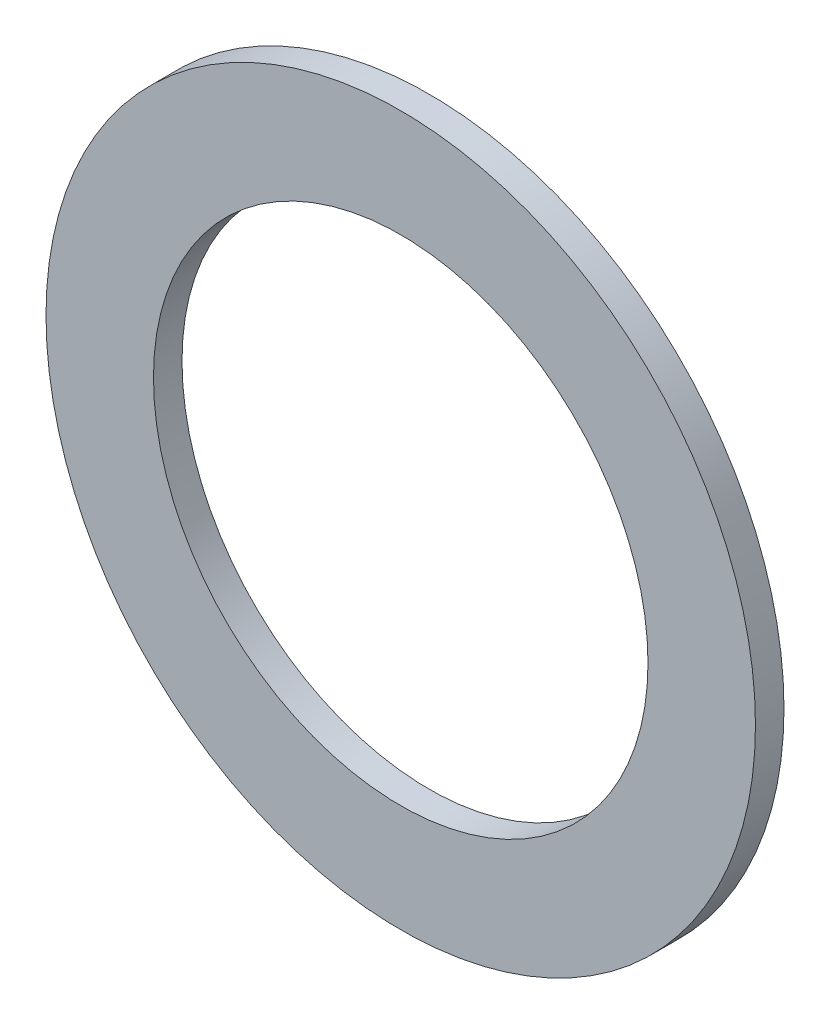
ISO-10303-21;
HEADER;
FILE_DESCRIPTION(('STEP AP214'),'2;1');
FILE_NAME('part.step','',(''),(''),'','','');
FILE_SCHEMA(('AUTOMOTIVE_DESIGN { 1 0 10303 214 1 1 1 1 }'));
ENDSEC;
DATA;
#1=APPLICATION_CONTEXT('core data for automotive mechanical design processes');
#2=APPLICATION_PROTOCOL_DEFINITION('international standard','automotive_design',2000,#1);
#3=PRODUCT_CONTEXT('',#1,'mechanical');
#4=PRODUCT('Part','Part','',(#3));
#5=PRODUCT_RELATED_PRODUCT_CATEGORY('part','',(#4));
#6=PRODUCT_DEFINITION_FORMATION('','',#4);
#7=PRODUCT_DEFINITION_CONTEXT('part definition',#1,'design');
#8=PRODUCT_DEFINITION('design','',#6,#7);
#9=PRODUCT_DEFINITION_SHAPE('','',#8);
#10=(LENGTH_UNIT() NAMED_UNIT(*) SI_UNIT(.MILLI.,.METRE.));
#11=(NAMED_UNIT(*) PLANE_ANGLE_UNIT() SI_UNIT($,.RADIAN.));
#12=(NAMED_UNIT(*) SI_UNIT($,.STERADIAN.) SOLID_ANGLE_UNIT());
#13=UNCERTAINTY_MEASURE_WITH_UNIT(LENGTH_MEASURE(1.E-05),#10,'distance_accuracy_value','');
#14=(GEOMETRIC_REPRESENTATION_CONTEXT(3) GLOBAL_UNCERTAINTY_ASSIGNED_CONTEXT((#13)) GLOBAL_UNIT_ASSIGNED_CONTEXT((#10,
#11,#12)) REPRESENTATION_CONTEXT('',''));
#15=CARTESIAN_POINT('',(0.,0.,0.));
#16=DIRECTION('',(0.,0.,1.));
#17=DIRECTION('',(1.,0.,0.));
#18=AXIS2_PLACEMENT_3D('',#15,#16,#17);
#19=CARTESIAN_POINT('',(0.,37.3,-2.8));
#20=DIRECTION('',(0.,0.,1.));
#21=DIRECTION('',(1.,0.,0.));
#22=AXIS2_PLACEMENT_3D('',#19,#20,#21);
#23=PLANE('',#22);
#24=CARTESIAN_POINT('',(0.,0.,-2.8));
#25=DIRECTION('',(0.,0.,-1.));
#26=DIRECTION('',(-1.,0.,0.));
#27=AXIS2_PLACEMENT_3D('',#24,#25,#26);
#28=CIRCLE('',#27,26.);
#29=CARTESIAN_POINT('',(-26.,0.,-2.8));
#30=VERTEX_POINT('',#29);
#31=EDGE_CURVE('E12',#30,#30,#28,.T.);
#32=ORIENTED_EDGE('',*,*,#31,.T.);
#33=EDGE_LOOP('',(#32));
#34=FACE_BOUND('',#33,.T.);
#35=CARTESIAN_POINT('',(0.,0.,-2.8));
#36=DIRECTION('',(0.,0.,-1.));
#37=DIRECTION('',(-1.,0.,0.));
#38=AXIS2_PLACEMENT_3D('',#35,#36,#37);
#39=CIRCLE('',#38,37.3);
#40=CARTESIAN_POINT('',(-37.3,0.,-2.8));
#41=VERTEX_POINT('',#40);
#42=EDGE_CURVE('E73',#41,#41,#39,.T.);
#43=ORIENTED_EDGE('',*,*,#42,.F.);
#44=EDGE_LOOP('',(#43));
#45=FACE_BOUND('',#44,.T.);
#46=ADVANCED_FACE('F59',(#34,#45),#23,.T.);
#47=CARTESIAN_POINT('',(0.,0.,-5.48));
#48=DIRECTION('',(0.,0.,-1.));
#49=DIRECTION('',(-1.,0.,0.));
#50=AXIS2_PLACEMENT_3D('',#47,#48,#49);
#51=CYLINDRICAL_SURFACE('',#50,26.);
#52=CARTESIAN_POINT('',(0.,0.,-5.8));
#53=DIRECTION('',(0.,0.,-1.));
#54=DIRECTION('',(-1.,0.,0.));
#55=AXIS2_PLACEMENT_3D('',#52,#53,#54);
#56=CIRCLE('',#55,26.);
#57=CARTESIAN_POINT('',(-26.,0.,-5.8));
#58=VERTEX_POINT('',#57);
#59=EDGE_CURVE('E65',#58,#58,#56,.T.);
#60=ORIENTED_EDGE('',*,*,#59,.T.);
#61=EDGE_LOOP('',(#60));
#62=FACE_BOUND('',#61,.T.);
#63=ORIENTED_EDGE('',*,*,#31,.F.);
#64=EDGE_LOOP('',(#63));
#65=FACE_BOUND('',#64,.T.);
#66=ADVANCED_FACE('F83',(#62,#65),#51,.F.);
#67=CARTESIAN_POINT('',(0.,26.,-5.8));
#68=DIRECTION('',(0.,0.,-1.));
#69=DIRECTION('',(-1.,0.,0.));
#70=AXIS2_PLACEMENT_3D('',#67,#68,#69);
#71=PLANE('',#70);
#72=CARTESIAN_POINT('',(0.,0.,-5.8));
#73=DIRECTION('',(0.,0.,-1.));
#74=DIRECTION('',(-1.,0.,0.));
#75=AXIS2_PLACEMENT_3D('',#72,#73,#74);
#76=CIRCLE('',#75,37.3);
#77=CARTESIAN_POINT('',(-37.3,0.,-5.8));
#78=VERTEX_POINT('',#77);
#79=EDGE_CURVE('E69',#78,#78,#76,.T.);
#80=ORIENTED_EDGE('',*,*,#79,.T.);
#81=EDGE_LOOP('',(#80));
#82=FACE_BOUND('',#81,.T.);
#83=ORIENTED_EDGE('',*,*,#59,.F.);
#84=EDGE_LOOP('',(#83));
#85=FACE_BOUND('',#84,.T.);
#86=ADVANCED_FACE('F87',(#82,#85),#71,.T.);
#87=CARTESIAN_POINT('',(0.,0.,-5.48));
#88=DIRECTION('',(0.,0.,-1.));
#89=DIRECTION('',(-1.,0.,0.));
#90=AXIS2_PLACEMENT_3D('',#87,#88,#89);
#91=CYLINDRICAL_SURFACE('',#90,37.3);
#92=ORIENTED_EDGE('',*,*,#42,.T.);
#93=EDGE_LOOP('',(#92));
#94=FACE_BOUND('',#93,.T.);
#95=ORIENTED_EDGE('',*,*,#79,.F.);
#96=EDGE_LOOP('',(#95));
#97=FACE_BOUND('',#96,.T.);
#98=ADVANCED_FACE('F79',(#94,#97),#91,.T.);
#99=CLOSED_SHELL('',(#46,#66,#86,#98));
#100=MANIFOLD_SOLID_BREP('B2',#99);
#101=ADVANCED_BREP_SHAPE_REPRESENTATION('',(#18,#100),#14);
#102=SHAPE_DEFINITION_REPRESENTATION(#9,#101);
ENDSEC;
END-ISO-10303-21;
